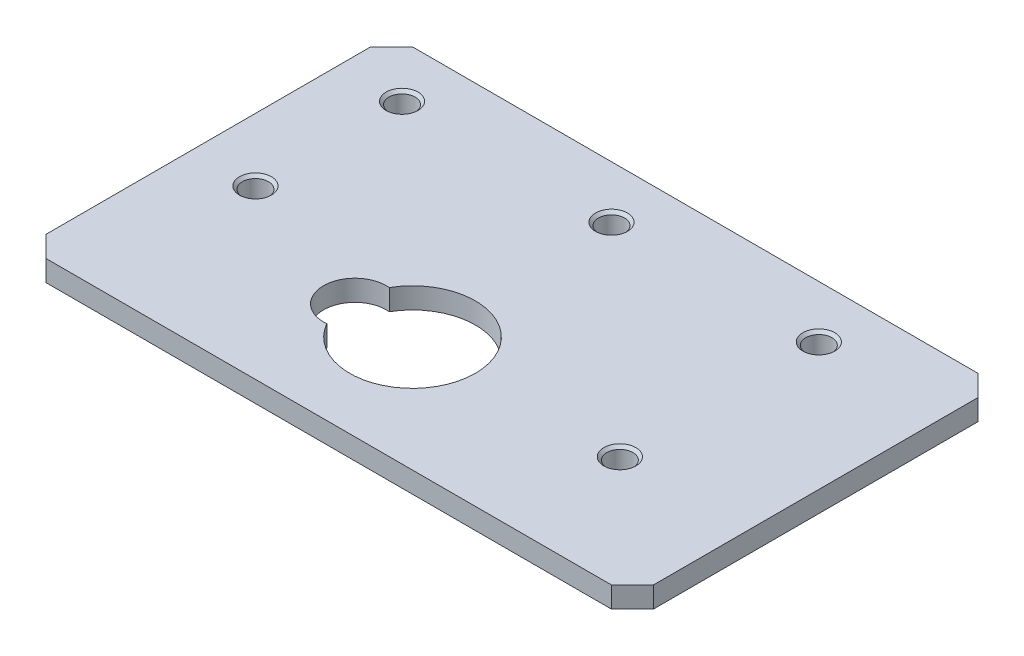
ISO-10303-21;
HEADER;
FILE_DESCRIPTION(('STEP AP214'),'2;1');
FILE_NAME('part.step','',(''),(''),'','','');
FILE_SCHEMA(('AUTOMOTIVE_DESIGN { 1 0 10303 214 1 1 1 1 }'));
ENDSEC;
DATA;
#1=APPLICATION_CONTEXT('core data for automotive mechanical design processes');
#2=APPLICATION_PROTOCOL_DEFINITION('international standard','automotive_design',2000,#1);
#3=PRODUCT_CONTEXT('',#1,'mechanical');
#4=PRODUCT('Part','Part','',(#3));
#5=PRODUCT_RELATED_PRODUCT_CATEGORY('part','',(#4));
#6=PRODUCT_DEFINITION_FORMATION('','',#4);
#7=PRODUCT_DEFINITION_CONTEXT('part definition',#1,'design');
#8=PRODUCT_DEFINITION('design','',#6,#7);
#9=PRODUCT_DEFINITION_SHAPE('','',#8);
#10=(LENGTH_UNIT() NAMED_UNIT(*) SI_UNIT(.MILLI.,.METRE.));
#11=(NAMED_UNIT(*) PLANE_ANGLE_UNIT() SI_UNIT($,.RADIAN.));
#12=(NAMED_UNIT(*) SI_UNIT($,.STERADIAN.) SOLID_ANGLE_UNIT());
#13=UNCERTAINTY_MEASURE_WITH_UNIT(LENGTH_MEASURE(1.E-05),#10,'distance_accuracy_value','');
#14=(GEOMETRIC_REPRESENTATION_CONTEXT(3) GLOBAL_UNCERTAINTY_ASSIGNED_CONTEXT((#13)) GLOBAL_UNIT_ASSIGNED_CONTEXT((#10,
#11,#12)) REPRESENTATION_CONTEXT('',''));
#15=CARTESIAN_POINT('',(0.,0.,0.));
#16=DIRECTION('',(0.,0.,1.));
#17=DIRECTION('',(1.,0.,0.));
#18=AXIS2_PLACEMENT_3D('',#15,#16,#17);
#19=CARTESIAN_POINT('',(29.,2.,17.5));
#20=DIRECTION('',(-1.,0.,0.));
#21=DIRECTION('',(0.,0.,1.));
#22=AXIS2_PLACEMENT_3D('',#19,#20,#21);
#23=PLANE('',#22);
#24=DIRECTION('',(0.,0.,-1.));
#25=VECTOR('',#24,1.);
#26=CARTESIAN_POINT('',(29.,0.,17.5));
#27=LINE('',#26,#25);
#28=CARTESIAN_POINT('',(29.,0.,15.5));
#29=VERTEX_POINT('',#28);
#30=CARTESIAN_POINT('',(29.,0.,-15.5));
#31=VERTEX_POINT('',#30);
#32=EDGE_CURVE('E222',#29,#31,#27,.T.);
#33=ORIENTED_EDGE('',*,*,#32,.T.);
#34=DIRECTION('',(0.,1.,0.));
#35=VECTOR('',#34,1.);
#36=CARTESIAN_POINT('',(29.,2.,-15.5));
#37=LINE('',#36,#35);
#38=CARTESIAN_POINT('',(29.,2.,-15.5));
#39=VERTEX_POINT('',#38);
#40=EDGE_CURVE('E11',#31,#39,#37,.T.);
#41=ORIENTED_EDGE('',*,*,#40,.T.);
#42=DIRECTION('',(0.,0.,-1.));
#43=VECTOR('',#42,1.);
#44=CARTESIAN_POINT('',(29.,2.,17.5));
#45=LINE('',#44,#43);
#46=CARTESIAN_POINT('',(29.,2.,15.5));
#47=VERTEX_POINT('',#46);
#48=EDGE_CURVE('E223',#47,#39,#45,.T.);
#49=ORIENTED_EDGE('',*,*,#48,.F.);
#50=DIRECTION('',(0.,-1.,0.));
#51=VECTOR('',#50,1.);
#52=CARTESIAN_POINT('',(29.,2.,15.5));
#53=LINE('',#52,#51);
#54=EDGE_CURVE('E61',#47,#29,#53,.T.);
#55=ORIENTED_EDGE('',*,*,#54,.T.);
#56=EDGE_LOOP('',(#33,#41,#49,#55));
#57=FACE_BOUND('',#56,.T.);
#58=ADVANCED_FACE('F51',(#57),#23,.F.);
#59=CARTESIAN_POINT('',(-29.,2.,-17.5));
#60=DIRECTION('',(0.,0.,1.));
#61=DIRECTION('',(1.,0.,0.));
#62=AXIS2_PLACEMENT_3D('',#59,#60,#61);
#63=PLANE('',#62);
#64=DIRECTION('',(-1.,0.,0.));
#65=VECTOR('',#64,1.);
#66=CARTESIAN_POINT('',(-29.,0.,-17.5));
#67=LINE('',#66,#65);
#68=CARTESIAN_POINT('',(27.,0.,-17.5));
#69=VERTEX_POINT('',#68);
#70=CARTESIAN_POINT('',(-27.,0.,-17.5));
#71=VERTEX_POINT('',#70);
#72=EDGE_CURVE('E242',#69,#71,#67,.T.);
#73=ORIENTED_EDGE('',*,*,#72,.T.);
#74=DIRECTION('',(0.,1.,0.));
#75=VECTOR('',#74,1.);
#76=CARTESIAN_POINT('',(-27.,2.,-17.5));
#77=LINE('',#76,#75);
#78=CARTESIAN_POINT('',(-27.,2.,-17.5));
#79=VERTEX_POINT('',#78);
#80=EDGE_CURVE('E274',#71,#79,#77,.T.);
#81=ORIENTED_EDGE('',*,*,#80,.T.);
#82=DIRECTION('',(-1.,0.,0.));
#83=VECTOR('',#82,1.);
#84=CARTESIAN_POINT('',(-29.,2.,-17.5));
#85=LINE('',#84,#83);
#86=CARTESIAN_POINT('',(27.,2.,-17.5));
#87=VERTEX_POINT('',#86);
#88=EDGE_CURVE('E227',#87,#79,#85,.T.);
#89=ORIENTED_EDGE('',*,*,#88,.F.);
#90=DIRECTION('',(0.,-1.,0.));
#91=VECTOR('',#90,1.);
#92=CARTESIAN_POINT('',(27.,2.,-17.5));
#93=LINE('',#92,#91);
#94=EDGE_CURVE('E270',#87,#69,#93,.T.);
#95=ORIENTED_EDGE('',*,*,#94,.T.);
#96=EDGE_LOOP('',(#73,#81,#89,#95));
#97=FACE_BOUND('',#96,.T.);
#98=ADVANCED_FACE('F312',(#97),#63,.F.);
#99=CARTESIAN_POINT('',(-29.,2.,17.5));
#100=DIRECTION('',(1.,0.,0.));
#101=DIRECTION('',(0.,0.,-1.));
#102=AXIS2_PLACEMENT_3D('',#99,#100,#101);
#103=PLANE('',#102);
#104=DIRECTION('',(0.,0.,1.));
#105=VECTOR('',#104,1.);
#106=CARTESIAN_POINT('',(-29.,2.,17.5));
#107=LINE('',#106,#105);
#108=CARTESIAN_POINT('',(-29.,2.,-15.5));
#109=VERTEX_POINT('',#108);
#110=CARTESIAN_POINT('',(-29.,2.,15.5));
#111=VERTEX_POINT('',#110);
#112=EDGE_CURVE('E232',#109,#111,#107,.T.);
#113=ORIENTED_EDGE('',*,*,#112,.F.);
#114=DIRECTION('',(0.,-1.,0.));
#115=VECTOR('',#114,1.);
#116=CARTESIAN_POINT('',(-29.,2.,-15.5));
#117=LINE('',#116,#115);
#118=CARTESIAN_POINT('',(-29.,0.,-15.5));
#119=VERTEX_POINT('',#118);
#120=EDGE_CURVE('E254',#109,#119,#117,.T.);
#121=ORIENTED_EDGE('',*,*,#120,.T.);
#122=DIRECTION('',(0.,0.,1.));
#123=VECTOR('',#122,1.);
#124=CARTESIAN_POINT('',(-29.,0.,17.5));
#125=LINE('',#124,#123);
#126=CARTESIAN_POINT('',(-29.,0.,15.5));
#127=VERTEX_POINT('',#126);
#128=EDGE_CURVE('E246',#119,#127,#125,.T.);
#129=ORIENTED_EDGE('',*,*,#128,.T.);
#130=DIRECTION('',(0.,1.,0.));
#131=VECTOR('',#130,1.);
#132=CARTESIAN_POINT('',(-29.,2.,15.5));
#133=LINE('',#132,#131);
#134=EDGE_CURVE('E238',#127,#111,#133,.T.);
#135=ORIENTED_EDGE('',*,*,#134,.T.);
#136=EDGE_LOOP('',(#113,#121,#129,#135));
#137=FACE_BOUND('',#136,.T.);
#138=ADVANCED_FACE('F321',(#137),#103,.F.);
#139=CARTESIAN_POINT('',(-29.,2.,17.5));
#140=DIRECTION('',(0.,0.,-1.));
#141=DIRECTION('',(-1.,0.,0.));
#142=AXIS2_PLACEMENT_3D('',#139,#140,#141);
#143=PLANE('',#142);
#144=DIRECTION('',(1.,0.,0.));
#145=VECTOR('',#144,1.);
#146=CARTESIAN_POINT('',(-29.,2.,17.5));
#147=LINE('',#146,#145);
#148=CARTESIAN_POINT('',(-27.,2.,17.5));
#149=VERTEX_POINT('',#148);
#150=CARTESIAN_POINT('',(27.,2.,17.5));
#151=VERTEX_POINT('',#150);
#152=EDGE_CURVE('E235',#149,#151,#147,.T.);
#153=ORIENTED_EDGE('',*,*,#152,.F.);
#154=DIRECTION('',(0.,-1.,0.));
#155=VECTOR('',#154,1.);
#156=CARTESIAN_POINT('',(-27.,2.,17.5));
#157=LINE('',#156,#155);
#158=CARTESIAN_POINT('',(-27.,0.,17.5));
#159=VERTEX_POINT('',#158);
#160=EDGE_CURVE('E290',#149,#159,#157,.T.);
#161=ORIENTED_EDGE('',*,*,#160,.T.);
#162=DIRECTION('',(1.,0.,0.));
#163=VECTOR('',#162,1.);
#164=CARTESIAN_POINT('',(-29.,0.,17.5));
#165=LINE('',#164,#163);
#166=CARTESIAN_POINT('',(27.,0.,17.5));
#167=VERTEX_POINT('',#166);
#168=EDGE_CURVE('E228',#159,#167,#165,.T.);
#169=ORIENTED_EDGE('',*,*,#168,.T.);
#170=DIRECTION('',(0.,1.,0.));
#171=VECTOR('',#170,1.);
#172=CARTESIAN_POINT('',(27.,2.,17.5));
#173=LINE('',#172,#171);
#174=EDGE_CURVE('E68',#167,#151,#173,.T.);
#175=ORIENTED_EDGE('',*,*,#174,.T.);
#176=EDGE_LOOP('',(#153,#161,#169,#175));
#177=FACE_BOUND('',#176,.T.);
#178=ADVANCED_FACE('F326',(#177),#143,.F.);
#179=CARTESIAN_POINT('',(0.,2.,0.));
#180=DIRECTION('',(0.,-1.,0.));
#181=DIRECTION('',(0.,0.,-1.));
#182=AXIS2_PLACEMENT_3D('',#179,#180,#181);
#183=PLANE('',#182);
#184=CARTESIAN_POINT('',(-8.50000000000001,2.,6.50000000000001));
#185=DIRECTION('',(0.,1.,0.));
#186=DIRECTION('',(0.,0.,1.));
#187=AXIS2_PLACEMENT_3D('',#184,#185,#186);
#188=CIRCLE('',#187,3.);
#189=CARTESIAN_POINT('',(-8.20454545454546,2.,3.51458434860902));
#190=VERTEX_POINT('',#189);
#191=CARTESIAN_POINT('',(-8.20454545454546,2.,9.48541565139099));
#192=VERTEX_POINT('',#191);
#193=EDGE_CURVE('E153',#190,#192,#188,.T.);
#194=ORIENTED_EDGE('',*,*,#193,.F.);
#195=CARTESIAN_POINT('',(-3.00000000000001,2.,6.50000000000001));
#196=DIRECTION('',(0.,1.,0.));
#197=DIRECTION('',(0.,0.,1.));
#198=AXIS2_PLACEMENT_3D('',#195,#196,#197);
#199=CIRCLE('',#198,6.);
#200=EDGE_CURVE('E137',#192,#190,#199,.T.);
#201=ORIENTED_EDGE('',*,*,#200,.F.);
#202=EDGE_LOOP('',(#194,#201));
#203=FACE_BOUND('',#202,.T.);
#204=CARTESIAN_POINT('',(-23.,2.,-12.5));
#205=DIRECTION('',(0.,1.,0.));
#206=DIRECTION('',(0.,0.,1.));
#207=AXIS2_PLACEMENT_3D('',#204,#205,#206);
#208=CIRCLE('',#207,1.525);
#209=CARTESIAN_POINT('',(-23.,2.,-10.975));
#210=VERTEX_POINT('',#209);
#211=EDGE_CURVE('E161',#210,#210,#208,.T.);
#212=ORIENTED_EDGE('',*,*,#211,.F.);
#213=EDGE_LOOP('',(#212));
#214=FACE_BOUND('',#213,.T.);
#215=CARTESIAN_POINT('',(-3.,2.,-12.5));
#216=DIRECTION('',(0.,1.,0.));
#217=DIRECTION('',(0.,0.,1.));
#218=AXIS2_PLACEMENT_3D('',#215,#216,#217);
#219=CIRCLE('',#218,1.525);
#220=CARTESIAN_POINT('',(-3.,2.,-10.975));
#221=VERTEX_POINT('',#220);
#222=EDGE_CURVE('E174',#221,#221,#219,.T.);
#223=ORIENTED_EDGE('',*,*,#222,.F.);
#224=EDGE_LOOP('',(#223));
#225=FACE_BOUND('',#224,.T.);
#226=CARTESIAN_POINT('',(16.8,2.,-12.5));
#227=DIRECTION('',(0.,1.,0.));
#228=DIRECTION('',(0.,0.,1.));
#229=AXIS2_PLACEMENT_3D('',#226,#227,#228);
#230=CIRCLE('',#229,1.525);
#231=CARTESIAN_POINT('',(16.8,2.,-10.975));
#232=VERTEX_POINT('',#231);
#233=EDGE_CURVE('E186',#232,#232,#230,.T.);
#234=ORIENTED_EDGE('',*,*,#233,.F.);
#235=EDGE_LOOP('',(#234));
#236=FACE_BOUND('',#235,.T.);
#237=CARTESIAN_POINT('',(16.8,2.,6.50000000000001));
#238=DIRECTION('',(0.,1.,0.));
#239=DIRECTION('',(0.,0.,1.));
#240=AXIS2_PLACEMENT_3D('',#237,#238,#239);
#241=CIRCLE('',#240,1.525);
#242=CARTESIAN_POINT('',(16.8,2.,8.025));
#243=VERTEX_POINT('',#242);
#244=EDGE_CURVE('E198',#243,#243,#241,.T.);
#245=ORIENTED_EDGE('',*,*,#244,.F.);
#246=EDGE_LOOP('',(#245));
#247=FACE_BOUND('',#246,.T.);
#248=CARTESIAN_POINT('',(-23.,2.,1.5));
#249=DIRECTION('',(0.,1.,0.));
#250=DIRECTION('',(0.,0.,1.));
#251=AXIS2_PLACEMENT_3D('',#248,#249,#250);
#252=CIRCLE('',#251,1.525);
#253=CARTESIAN_POINT('',(-23.,2.,3.025));
#254=VERTEX_POINT('',#253);
#255=EDGE_CURVE('E210',#254,#254,#252,.T.);
#256=ORIENTED_EDGE('',*,*,#255,.F.);
#257=EDGE_LOOP('',(#256));
#258=FACE_BOUND('',#257,.T.);
#259=ORIENTED_EDGE('',*,*,#88,.T.);
#260=DIRECTION('',(0.707106781186549,0.,-0.707106781186546));
#261=VECTOR('',#260,1.);
#262=CARTESIAN_POINT('',(-29.,2.,-15.5));
#263=LINE('',#262,#261);
#264=EDGE_CURVE('E285',#79,#109,#263,.F.);
#265=ORIENTED_EDGE('',*,*,#264,.T.);
#266=ORIENTED_EDGE('',*,*,#112,.T.);
#267=DIRECTION('',(-0.707106781186546,0.,-0.707106781186549));
#268=VECTOR('',#267,1.);
#269=CARTESIAN_POINT('',(-27.,2.,17.5));
#270=LINE('',#269,#268);
#271=EDGE_CURVE('E75',#111,#149,#270,.F.);
#272=ORIENTED_EDGE('',*,*,#271,.T.);
#273=ORIENTED_EDGE('',*,*,#152,.T.);
#274=DIRECTION('',(-0.707106781186548,0.,0.707106781186548));
#275=VECTOR('',#274,1.);
#276=CARTESIAN_POINT('',(29.,2.,15.5));
#277=LINE('',#276,#275);
#278=EDGE_CURVE('E277',#151,#47,#277,.F.);
#279=ORIENTED_EDGE('',*,*,#278,.T.);
#280=ORIENTED_EDGE('',*,*,#48,.T.);
#281=DIRECTION('',(0.707106781186548,0.,0.707106781186548));
#282=VECTOR('',#281,1.);
#283=CARTESIAN_POINT('',(27.,2.,-17.5));
#284=LINE('',#283,#282);
#285=EDGE_CURVE('E280',#39,#87,#284,.F.);
#286=ORIENTED_EDGE('',*,*,#285,.T.);
#287=EDGE_LOOP('',(#259,#265,#266,#272,#273,#279,#280,#286));
#288=FACE_BOUND('',#287,.T.);
#289=ADVANCED_FACE('F315',(#203,#214,#225,#236,#247,#258,#288),#183,.F.);
#290=CARTESIAN_POINT('',(0.,0.,0.));
#291=DIRECTION('',(0.,-1.,0.));
#292=DIRECTION('',(0.,0.,-1.));
#293=AXIS2_PLACEMENT_3D('',#290,#291,#292);
#294=PLANE('',#293);
#295=CARTESIAN_POINT('',(-3.00000000000001,0.,6.50000000000001));
#296=DIRECTION('',(0.,1.,0.));
#297=DIRECTION('',(0.,0.,1.));
#298=AXIS2_PLACEMENT_3D('',#295,#296,#297);
#299=CIRCLE('',#298,6.);
#300=CARTESIAN_POINT('',(-8.20454545454546,0.,9.48541565139099));
#301=VERTEX_POINT('',#300);
#302=CARTESIAN_POINT('',(-8.20454545454546,0.,3.51458434860902));
#303=VERTEX_POINT('',#302);
#304=EDGE_CURVE('E134',#301,#303,#299,.T.);
#305=ORIENTED_EDGE('',*,*,#304,.T.);
#306=CARTESIAN_POINT('',(-8.50000000000001,0.,6.50000000000001));
#307=DIRECTION('',(0.,1.,0.));
#308=DIRECTION('',(0.,0.,1.));
#309=AXIS2_PLACEMENT_3D('',#306,#307,#308);
#310=CIRCLE('',#309,3.);
#311=EDGE_CURVE('E143',#303,#301,#310,.T.);
#312=ORIENTED_EDGE('',*,*,#311,.T.);
#313=EDGE_LOOP('',(#305,#312));
#314=FACE_BOUND('',#313,.T.);
#315=CARTESIAN_POINT('',(-23.,0.,-12.5));
#316=DIRECTION('',(0.,1.,0.));
#317=DIRECTION('',(0.,0.,1.));
#318=AXIS2_PLACEMENT_3D('',#315,#316,#317);
#319=CIRCLE('',#318,1.25);
#320=CARTESIAN_POINT('',(-23.,0.,-11.25));
#321=VERTEX_POINT('',#320);
#322=EDGE_CURVE('E170',#321,#321,#319,.T.);
#323=ORIENTED_EDGE('',*,*,#322,.T.);
#324=EDGE_LOOP('',(#323));
#325=FACE_BOUND('',#324,.T.);
#326=CARTESIAN_POINT('',(-3.,0.,-12.5));
#327=DIRECTION('',(0.,1.,0.));
#328=DIRECTION('',(0.,0.,1.));
#329=AXIS2_PLACEMENT_3D('',#326,#327,#328);
#330=CIRCLE('',#329,1.25);
#331=CARTESIAN_POINT('',(-3.,0.,-11.25));
#332=VERTEX_POINT('',#331);
#333=EDGE_CURVE('E182',#332,#332,#330,.T.);
#334=ORIENTED_EDGE('',*,*,#333,.T.);
#335=EDGE_LOOP('',(#334));
#336=FACE_BOUND('',#335,.T.);
#337=CARTESIAN_POINT('',(16.8,0.,-12.5));
#338=DIRECTION('',(0.,1.,0.));
#339=DIRECTION('',(0.,0.,1.));
#340=AXIS2_PLACEMENT_3D('',#337,#338,#339);
#341=CIRCLE('',#340,1.25);
#342=CARTESIAN_POINT('',(16.8,0.,-11.25));
#343=VERTEX_POINT('',#342);
#344=EDGE_CURVE('E194',#343,#343,#341,.T.);
#345=ORIENTED_EDGE('',*,*,#344,.T.);
#346=EDGE_LOOP('',(#345));
#347=FACE_BOUND('',#346,.T.);
#348=CARTESIAN_POINT('',(16.8,0.,6.50000000000001));
#349=DIRECTION('',(0.,1.,0.));
#350=DIRECTION('',(0.,0.,1.));
#351=AXIS2_PLACEMENT_3D('',#348,#349,#350);
#352=CIRCLE('',#351,1.25);
#353=CARTESIAN_POINT('',(16.8,0.,7.75000000000001));
#354=VERTEX_POINT('',#353);
#355=EDGE_CURVE('E206',#354,#354,#352,.T.);
#356=ORIENTED_EDGE('',*,*,#355,.T.);
#357=EDGE_LOOP('',(#356));
#358=FACE_BOUND('',#357,.T.);
#359=CARTESIAN_POINT('',(-23.,0.,1.5));
#360=DIRECTION('',(0.,1.,0.));
#361=DIRECTION('',(0.,0.,1.));
#362=AXIS2_PLACEMENT_3D('',#359,#360,#361);
#363=CIRCLE('',#362,1.25);
#364=CARTESIAN_POINT('',(-23.,0.,2.75000000000001));
#365=VERTEX_POINT('',#364);
#366=EDGE_CURVE('E218',#365,#365,#363,.T.);
#367=ORIENTED_EDGE('',*,*,#366,.T.);
#368=EDGE_LOOP('',(#367));
#369=FACE_BOUND('',#368,.T.);
#370=ORIENTED_EDGE('',*,*,#128,.F.);
#371=DIRECTION('',(-0.707106781186549,0.,0.707106781186546));
#372=VECTOR('',#371,1.);
#373=CARTESIAN_POINT('',(-22.2499999999999,0.,-22.25));
#374=LINE('',#373,#372);
#375=EDGE_CURVE('E267',#119,#71,#374,.F.);
#376=ORIENTED_EDGE('',*,*,#375,.T.);
#377=ORIENTED_EDGE('',*,*,#72,.F.);
#378=DIRECTION('',(-0.707106781186548,0.,-0.707106781186548));
#379=VECTOR('',#378,1.);
#380=CARTESIAN_POINT('',(22.25,0.,-22.25));
#381=LINE('',#380,#379);
#382=EDGE_CURVE('E261',#69,#31,#381,.F.);
#383=ORIENTED_EDGE('',*,*,#382,.T.);
#384=ORIENTED_EDGE('',*,*,#32,.F.);
#385=DIRECTION('',(0.707106781186548,0.,-0.707106781186548));
#386=VECTOR('',#385,1.);
#387=CARTESIAN_POINT('',(22.25,0.,22.25));
#388=LINE('',#387,#386);
#389=EDGE_CURVE('E258',#29,#167,#388,.F.);
#390=ORIENTED_EDGE('',*,*,#389,.T.);
#391=ORIENTED_EDGE('',*,*,#168,.F.);
#392=DIRECTION('',(0.707106781186546,0.,0.707106781186549));
#393=VECTOR('',#392,1.);
#394=CARTESIAN_POINT('',(-22.25,0.,22.25));
#395=LINE('',#394,#393);
#396=EDGE_CURVE('E264',#159,#127,#395,.F.);
#397=ORIENTED_EDGE('',*,*,#396,.T.);
#398=EDGE_LOOP('',(#370,#376,#377,#383,#384,#390,#391,#397));
#399=FACE_BOUND('',#398,.T.);
#400=ADVANCED_FACE('F150',(#314,#325,#336,#347,#358,#369,#399),#294,.T.);
#401=CARTESIAN_POINT('',(-23.,2.,1.5));
#402=DIRECTION('',(0.,1.,0.));
#403=DIRECTION('',(0.,0.,1.));
#404=AXIS2_PLACEMENT_3D('',#401,#402,#403);
#405=CYLINDRICAL_SURFACE('',#404,1.25);
#406=ORIENTED_EDGE('',*,*,#366,.F.);
#407=EDGE_LOOP('',(#406));
#408=FACE_BOUND('',#407,.T.);
#409=CARTESIAN_POINT('',(-23.,1.725,1.5));
#410=DIRECTION('',(0.,1.,0.));
#411=DIRECTION('',(0.,0.,1.));
#412=AXIS2_PLACEMENT_3D('',#409,#410,#411);
#413=CIRCLE('',#412,1.25);
#414=CARTESIAN_POINT('',(-23.,1.725,2.75000000000001));
#415=VERTEX_POINT('',#414);
#416=EDGE_CURVE('E214',#415,#415,#413,.T.);
#417=ORIENTED_EDGE('',*,*,#416,.T.);
#418=EDGE_LOOP('',(#417));
#419=FACE_BOUND('',#418,.T.);
#420=ADVANCED_FACE('F476',(#408,#419),#405,.F.);
#421=CARTESIAN_POINT('',(-23.,2.,1.5));
#422=DIRECTION('',(0.,1.,0.));
#423=DIRECTION('',(0.,0.,1.));
#424=AXIS2_PLACEMENT_3D('',#421,#422,#423);
#425=CONICAL_SURFACE('',#424,1.525,0.785398163397442);
#426=ORIENTED_EDGE('',*,*,#416,.F.);
#427=EDGE_LOOP('',(#426));
#428=FACE_BOUND('',#427,.T.);
#429=ORIENTED_EDGE('',*,*,#255,.T.);
#430=EDGE_LOOP('',(#429));
#431=FACE_BOUND('',#430,.T.);
#432=ADVANCED_FACE('F466',(#428,#431),#425,.F.);
#433=CARTESIAN_POINT('',(16.8,2.,6.50000000000001));
#434=DIRECTION('',(0.,1.,0.));
#435=DIRECTION('',(0.,0.,1.));
#436=AXIS2_PLACEMENT_3D('',#433,#434,#435);
#437=CYLINDRICAL_SURFACE('',#436,1.25);
#438=ORIENTED_EDGE('',*,*,#355,.F.);
#439=EDGE_LOOP('',(#438));
#440=FACE_BOUND('',#439,.T.);
#441=CARTESIAN_POINT('',(16.8,1.725,6.50000000000001));
#442=DIRECTION('',(0.,1.,0.));
#443=DIRECTION('',(0.,0.,1.));
#444=AXIS2_PLACEMENT_3D('',#441,#442,#443);
#445=CIRCLE('',#444,1.25);
#446=CARTESIAN_POINT('',(16.8,1.725,7.75000000000001));
#447=VERTEX_POINT('',#446);
#448=EDGE_CURVE('E202',#447,#447,#445,.T.);
#449=ORIENTED_EDGE('',*,*,#448,.T.);
#450=EDGE_LOOP('',(#449));
#451=FACE_BOUND('',#450,.T.);
#452=ADVANCED_FACE('F456',(#440,#451),#437,.F.);
#453=CARTESIAN_POINT('',(16.8,2.,6.50000000000001));
#454=DIRECTION('',(0.,1.,0.));
#455=DIRECTION('',(0.,0.,1.));
#456=AXIS2_PLACEMENT_3D('',#453,#454,#455);
#457=CONICAL_SURFACE('',#456,1.525,0.785398163397442);
#458=ORIENTED_EDGE('',*,*,#448,.F.);
#459=EDGE_LOOP('',(#458));
#460=FACE_BOUND('',#459,.T.);
#461=ORIENTED_EDGE('',*,*,#244,.T.);
#462=EDGE_LOOP('',(#461));
#463=FACE_BOUND('',#462,.T.);
#464=ADVANCED_FACE('F446',(#460,#463),#457,.F.);
#465=CARTESIAN_POINT('',(16.8,2.,-12.5));
#466=DIRECTION('',(0.,1.,0.));
#467=DIRECTION('',(0.,0.,1.));
#468=AXIS2_PLACEMENT_3D('',#465,#466,#467);
#469=CYLINDRICAL_SURFACE('',#468,1.25);
#470=ORIENTED_EDGE('',*,*,#344,.F.);
#471=EDGE_LOOP('',(#470));
#472=FACE_BOUND('',#471,.T.);
#473=CARTESIAN_POINT('',(16.8,1.725,-12.5));
#474=DIRECTION('',(0.,1.,0.));
#475=DIRECTION('',(0.,0.,1.));
#476=AXIS2_PLACEMENT_3D('',#473,#474,#475);
#477=CIRCLE('',#476,1.25);
#478=CARTESIAN_POINT('',(16.8,1.725,-11.25));
#479=VERTEX_POINT('',#478);
#480=EDGE_CURVE('E190',#479,#479,#477,.T.);
#481=ORIENTED_EDGE('',*,*,#480,.T.);
#482=EDGE_LOOP('',(#481));
#483=FACE_BOUND('',#482,.T.);
#484=ADVANCED_FACE('F436',(#472,#483),#469,.F.);
#485=CARTESIAN_POINT('',(16.8,2.,-12.5));
#486=DIRECTION('',(0.,1.,0.));
#487=DIRECTION('',(0.,0.,1.));
#488=AXIS2_PLACEMENT_3D('',#485,#486,#487);
#489=CONICAL_SURFACE('',#488,1.525,0.785398163397442);
#490=ORIENTED_EDGE('',*,*,#480,.F.);
#491=EDGE_LOOP('',(#490));
#492=FACE_BOUND('',#491,.T.);
#493=ORIENTED_EDGE('',*,*,#233,.T.);
#494=EDGE_LOOP('',(#493));
#495=FACE_BOUND('',#494,.T.);
#496=ADVANCED_FACE('F426',(#492,#495),#489,.F.);
#497=CARTESIAN_POINT('',(-3.,2.,-12.5));
#498=DIRECTION('',(0.,1.,0.));
#499=DIRECTION('',(0.,0.,1.));
#500=AXIS2_PLACEMENT_3D('',#497,#498,#499);
#501=CYLINDRICAL_SURFACE('',#500,1.25);
#502=ORIENTED_EDGE('',*,*,#333,.F.);
#503=EDGE_LOOP('',(#502));
#504=FACE_BOUND('',#503,.T.);
#505=CARTESIAN_POINT('',(-3.,1.725,-12.5));
#506=DIRECTION('',(0.,1.,0.));
#507=DIRECTION('',(0.,0.,1.));
#508=AXIS2_PLACEMENT_3D('',#505,#506,#507);
#509=CIRCLE('',#508,1.25);
#510=CARTESIAN_POINT('',(-3.,1.725,-11.25));
#511=VERTEX_POINT('',#510);
#512=EDGE_CURVE('E178',#511,#511,#509,.T.);
#513=ORIENTED_EDGE('',*,*,#512,.T.);
#514=EDGE_LOOP('',(#513));
#515=FACE_BOUND('',#514,.T.);
#516=ADVANCED_FACE('F416',(#504,#515),#501,.F.);
#517=CARTESIAN_POINT('',(-3.,2.,-12.5));
#518=DIRECTION('',(0.,1.,0.));
#519=DIRECTION('',(0.,0.,1.));
#520=AXIS2_PLACEMENT_3D('',#517,#518,#519);
#521=CONICAL_SURFACE('',#520,1.525,0.785398163397446);
#522=ORIENTED_EDGE('',*,*,#512,.F.);
#523=EDGE_LOOP('',(#522));
#524=FACE_BOUND('',#523,.T.);
#525=ORIENTED_EDGE('',*,*,#222,.T.);
#526=EDGE_LOOP('',(#525));
#527=FACE_BOUND('',#526,.T.);
#528=ADVANCED_FACE('F406',(#524,#527),#521,.F.);
#529=CARTESIAN_POINT('',(-23.,2.,-12.5));
#530=DIRECTION('',(0.,1.,0.));
#531=DIRECTION('',(0.,0.,1.));
#532=AXIS2_PLACEMENT_3D('',#529,#530,#531);
#533=CYLINDRICAL_SURFACE('',#532,1.25);
#534=ORIENTED_EDGE('',*,*,#322,.F.);
#535=EDGE_LOOP('',(#534));
#536=FACE_BOUND('',#535,.T.);
#537=CARTESIAN_POINT('',(-23.,1.725,-12.5));
#538=DIRECTION('',(0.,1.,0.));
#539=DIRECTION('',(0.,0.,1.));
#540=AXIS2_PLACEMENT_3D('',#537,#538,#539);
#541=CIRCLE('',#540,1.25);
#542=CARTESIAN_POINT('',(-23.,1.725,-11.25));
#543=VERTEX_POINT('',#542);
#544=EDGE_CURVE('E166',#543,#543,#541,.T.);
#545=ORIENTED_EDGE('',*,*,#544,.T.);
#546=EDGE_LOOP('',(#545));
#547=FACE_BOUND('',#546,.T.);
#548=ADVANCED_FACE('F396',(#536,#547),#533,.F.);
#549=CARTESIAN_POINT('',(-23.,2.,-12.5));
#550=DIRECTION('',(0.,1.,0.));
#551=DIRECTION('',(0.,0.,1.));
#552=AXIS2_PLACEMENT_3D('',#549,#550,#551);
#553=CONICAL_SURFACE('',#552,1.525,0.785398163397442);
#554=ORIENTED_EDGE('',*,*,#544,.F.);
#555=EDGE_LOOP('',(#554));
#556=FACE_BOUND('',#555,.T.);
#557=ORIENTED_EDGE('',*,*,#211,.T.);
#558=EDGE_LOOP('',(#557));
#559=FACE_BOUND('',#558,.T.);
#560=ADVANCED_FACE('F388',(#556,#559),#553,.F.);
#561=CARTESIAN_POINT('',(-3.00000000000001,0.,6.50000000000001));
#562=DIRECTION('',(0.,1.,0.));
#563=DIRECTION('',(0.,0.,1.));
#564=AXIS2_PLACEMENT_3D('',#561,#562,#563);
#565=CYLINDRICAL_SURFACE('',#564,6.);
#566=ORIENTED_EDGE('',*,*,#200,.T.);
#567=DIRECTION('',(0.,1.,0.));
#568=VECTOR('',#567,1.);
#569=CARTESIAN_POINT('',(-8.20454545454546,0.,3.51458434860902));
#570=LINE('',#569,#568);
#571=EDGE_CURVE('E130',#303,#190,#570,.T.);
#572=ORIENTED_EDGE('',*,*,#571,.F.);
#573=ORIENTED_EDGE('',*,*,#304,.F.);
#574=DIRECTION('',(0.,1.,0.));
#575=VECTOR('',#574,1.);
#576=CARTESIAN_POINT('',(-8.20454545454546,0.,9.48541565139099));
#577=LINE('',#576,#575);
#578=EDGE_CURVE('E142',#301,#192,#577,.T.);
#579=ORIENTED_EDGE('',*,*,#578,.T.);
#580=EDGE_LOOP('',(#566,#572,#573,#579));
#581=FACE_BOUND('',#580,.T.);
#582=ADVANCED_FACE('F132',(#581),#565,.F.);
#583=CARTESIAN_POINT('',(-8.50000000000001,0.,6.50000000000001));
#584=DIRECTION('',(0.,1.,0.));
#585=DIRECTION('',(0.,0.,1.));
#586=AXIS2_PLACEMENT_3D('',#583,#584,#585);
#587=CYLINDRICAL_SURFACE('',#586,3.);
#588=ORIENTED_EDGE('',*,*,#193,.T.);
#589=ORIENTED_EDGE('',*,*,#578,.F.);
#590=ORIENTED_EDGE('',*,*,#311,.F.);
#591=ORIENTED_EDGE('',*,*,#571,.T.);
#592=EDGE_LOOP('',(#588,#589,#590,#591));
#593=FACE_BOUND('',#592,.T.);
#594=ADVANCED_FACE('F146',(#593),#587,.F.);
#595=CARTESIAN_POINT('',(-29.,2.,-15.5));
#596=DIRECTION('',(0.707106781186546,0.,0.707106781186549));
#597=DIRECTION('',(0.,-1.,0.));
#598=AXIS2_PLACEMENT_3D('',#595,#596,#597);
#599=PLANE('',#598);
#600=ORIENTED_EDGE('',*,*,#264,.F.);
#601=ORIENTED_EDGE('',*,*,#80,.F.);
#602=ORIENTED_EDGE('',*,*,#375,.F.);
#603=ORIENTED_EDGE('',*,*,#120,.F.);
#604=EDGE_LOOP('',(#600,#601,#602,#603));
#605=FACE_BOUND('',#604,.T.);
#606=ADVANCED_FACE('F319',(#605),#599,.F.);
#607=CARTESIAN_POINT('',(-27.,2.,17.5));
#608=DIRECTION('',(0.707106781186549,0.,-0.707106781186546));
#609=DIRECTION('',(0.,-1.,0.));
#610=AXIS2_PLACEMENT_3D('',#607,#608,#609);
#611=PLANE('',#610);
#612=ORIENTED_EDGE('',*,*,#271,.F.);
#613=ORIENTED_EDGE('',*,*,#134,.F.);
#614=ORIENTED_EDGE('',*,*,#396,.F.);
#615=ORIENTED_EDGE('',*,*,#160,.F.);
#616=EDGE_LOOP('',(#612,#613,#614,#615));
#617=FACE_BOUND('',#616,.T.);
#618=ADVANCED_FACE('F325',(#617),#611,.F.);
#619=CARTESIAN_POINT('',(27.,2.,-17.5));
#620=DIRECTION('',(-0.707106781186547,0.,0.707106781186547));
#621=DIRECTION('',(0.,-1.,0.));
#622=AXIS2_PLACEMENT_3D('',#619,#620,#621);
#623=PLANE('',#622);
#624=ORIENTED_EDGE('',*,*,#285,.F.);
#625=ORIENTED_EDGE('',*,*,#40,.F.);
#626=ORIENTED_EDGE('',*,*,#382,.F.);
#627=ORIENTED_EDGE('',*,*,#94,.F.);
#628=EDGE_LOOP('',(#624,#625,#626,#627));
#629=FACE_BOUND('',#628,.T.);
#630=ADVANCED_FACE('F309',(#629),#623,.F.);
#631=CARTESIAN_POINT('',(29.,2.,15.5));
#632=DIRECTION('',(-0.707106781186547,0.,-0.707106781186547));
#633=DIRECTION('',(0.,-1.,0.));
#634=AXIS2_PLACEMENT_3D('',#631,#632,#633);
#635=PLANE('',#634);
#636=ORIENTED_EDGE('',*,*,#278,.F.);
#637=ORIENTED_EDGE('',*,*,#174,.F.);
#638=ORIENTED_EDGE('',*,*,#389,.F.);
#639=ORIENTED_EDGE('',*,*,#54,.F.);
#640=EDGE_LOOP('',(#636,#637,#638,#639));
#641=FACE_BOUND('',#640,.T.);
#642=ADVANCED_FACE('F54',(#641),#635,.F.);
#643=CLOSED_SHELL('',(#58,#98,#138,#178,#289,#400,#420,#432,#452,#464,#484,#496,#516,#528,#548,
#560,#582,#594,#606,#618,#630,#642));
#644=MANIFOLD_SOLID_BREP('B2',#643);
#645=ADVANCED_BREP_SHAPE_REPRESENTATION('',(#18,#644),#14);
#646=SHAPE_DEFINITION_REPRESENTATION(#9,#645);
ENDSEC;
END-ISO-10303-21;
